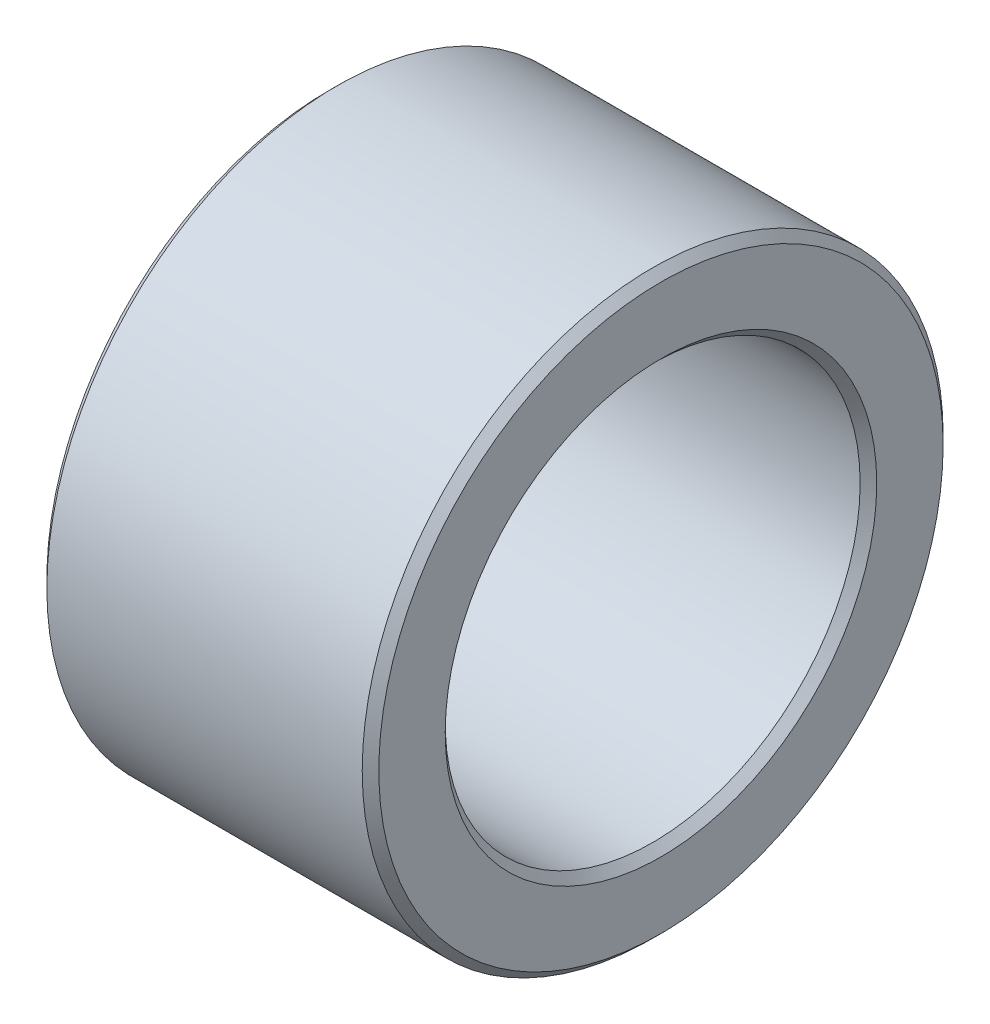
ISO-10303-21;
HEADER;
FILE_DESCRIPTION(('STEP AP214'),'2;1');
FILE_NAME('part.step','',(''),(''),'','','');
FILE_SCHEMA(('AUTOMOTIVE_DESIGN { 1 0 10303 214 1 1 1 1 }'));
ENDSEC;
DATA;
#1=APPLICATION_CONTEXT('core data for automotive mechanical design processes');
#2=APPLICATION_PROTOCOL_DEFINITION('international standard','automotive_design',2000,#1);
#3=PRODUCT_CONTEXT('',#1,'mechanical');
#4=PRODUCT('Part','Part','',(#3));
#5=PRODUCT_RELATED_PRODUCT_CATEGORY('part','',(#4));
#6=PRODUCT_DEFINITION_FORMATION('','',#4);
#7=PRODUCT_DEFINITION_CONTEXT('part definition',#1,'design');
#8=PRODUCT_DEFINITION('design','',#6,#7);
#9=PRODUCT_DEFINITION_SHAPE('','',#8);
#10=(LENGTH_UNIT() NAMED_UNIT(*) SI_UNIT(.MILLI.,.METRE.));
#11=(NAMED_UNIT(*) PLANE_ANGLE_UNIT() SI_UNIT($,.RADIAN.));
#12=(NAMED_UNIT(*) SI_UNIT($,.STERADIAN.) SOLID_ANGLE_UNIT());
#13=UNCERTAINTY_MEASURE_WITH_UNIT(LENGTH_MEASURE(1.E-05),#10,'distance_accuracy_value','');
#14=(GEOMETRIC_REPRESENTATION_CONTEXT(3) GLOBAL_UNCERTAINTY_ASSIGNED_CONTEXT((#13)) GLOBAL_UNIT_ASSIGNED_CONTEXT((#10,
#11,#12)) REPRESENTATION_CONTEXT('',''));
#15=CARTESIAN_POINT('',(0.,0.,0.));
#16=DIRECTION('',(0.,0.,1.));
#17=DIRECTION('',(1.,0.,0.));
#18=AXIS2_PLACEMENT_3D('',#15,#16,#17);
#19=CARTESIAN_POINT('',(4.,0.,0.));
#20=DIRECTION('',(1.,0.,0.));
#21=DIRECTION('',(0.,0.,-1.));
#22=AXIS2_PLACEMENT_3D('',#19,#20,#21);
#23=PLANE('',#22);
#24=CARTESIAN_POINT('',(4.,0.,0.));
#25=DIRECTION('',(1.,0.,0.));
#26=DIRECTION('',(0.,0.,-1.));
#27=AXIS2_PLACEMENT_3D('',#24,#25,#26);
#28=CIRCLE('',#27,2.6);
#29=CARTESIAN_POINT('',(4.,0.,-2.6));
#30=VERTEX_POINT('',#29);
#31=EDGE_CURVE('E70',#30,#30,#28,.F.);
#32=ORIENTED_EDGE('',*,*,#31,.T.);
#33=EDGE_LOOP('',(#32));
#34=FACE_BOUND('',#33,.T.);
#35=CARTESIAN_POINT('',(4.,0.,0.));
#36=DIRECTION('',(1.,0.,0.));
#37=DIRECTION('',(0.,0.,-1.));
#38=AXIS2_PLACEMENT_3D('',#35,#36,#37);
#39=CIRCLE('',#38,3.4);
#40=CARTESIAN_POINT('',(4.,0.,-3.4));
#41=VERTEX_POINT('',#40);
#42=EDGE_CURVE('E74',#41,#41,#39,.T.);
#43=ORIENTED_EDGE('',*,*,#42,.T.);
#44=EDGE_LOOP('',(#43));
#45=FACE_BOUND('',#44,.T.);
#46=ADVANCED_FACE('F45',(#34,#45),#23,.T.);
#47=CARTESIAN_POINT('',(0.,0.,0.));
#48=DIRECTION('',(1.,0.,0.));
#49=DIRECTION('',(0.,0.,-1.));
#50=AXIS2_PLACEMENT_3D('',#47,#48,#49);
#51=PLANE('',#50);
#52=CARTESIAN_POINT('',(0.,0.,0.));
#53=DIRECTION('',(1.,0.,0.));
#54=DIRECTION('',(0.,0.,-1.));
#55=AXIS2_PLACEMENT_3D('',#52,#53,#54);
#56=CIRCLE('',#55,2.6);
#57=CARTESIAN_POINT('',(0.,0.,-2.6));
#58=VERTEX_POINT('',#57);
#59=EDGE_CURVE('E59',#58,#58,#56,.T.);
#60=ORIENTED_EDGE('',*,*,#59,.T.);
#61=EDGE_LOOP('',(#60));
#62=FACE_BOUND('',#61,.T.);
#63=CARTESIAN_POINT('',(0.,0.,0.));
#64=DIRECTION('',(1.,0.,0.));
#65=DIRECTION('',(0.,0.,-1.));
#66=AXIS2_PLACEMENT_3D('',#63,#64,#65);
#67=CIRCLE('',#66,3.4);
#68=CARTESIAN_POINT('',(0.,0.,-3.4));
#69=VERTEX_POINT('',#68);
#70=EDGE_CURVE('E64',#69,#69,#67,.F.);
#71=ORIENTED_EDGE('',*,*,#70,.T.);
#72=EDGE_LOOP('',(#71));
#73=FACE_BOUND('',#72,.T.);
#74=ADVANCED_FACE('F97',(#62,#73),#51,.F.);
#75=CARTESIAN_POINT('',(4.,0.,0.));
#76=DIRECTION('',(-1.,0.,0.));
#77=DIRECTION('',(0.,0.,1.));
#78=AXIS2_PLACEMENT_3D('',#75,#76,#77);
#79=CYLINDRICAL_SURFACE('',#78,3.5);
#80=CARTESIAN_POINT('',(0.100000000000001,0.,0.));
#81=DIRECTION('',(1.,0.,0.));
#82=DIRECTION('',(0.,0.,-1.));
#83=AXIS2_PLACEMENT_3D('',#80,#81,#82);
#84=CIRCLE('',#83,3.5);
#85=CARTESIAN_POINT('',(0.100000000000001,0.,-3.5));
#86=VERTEX_POINT('',#85);
#87=EDGE_CURVE('E10',#86,#86,#84,.T.);
#88=ORIENTED_EDGE('',*,*,#87,.T.);
#89=EDGE_LOOP('',(#88));
#90=FACE_BOUND('',#89,.T.);
#91=CARTESIAN_POINT('',(3.9,0.,0.));
#92=DIRECTION('',(1.,0.,0.));
#93=DIRECTION('',(0.,0.,-1.));
#94=AXIS2_PLACEMENT_3D('',#91,#92,#93);
#95=CIRCLE('',#94,3.5);
#96=CARTESIAN_POINT('',(3.9,0.,-3.5));
#97=VERTEX_POINT('',#96);
#98=EDGE_CURVE('E54',#97,#97,#95,.F.);
#99=ORIENTED_EDGE('',*,*,#98,.T.);
#100=EDGE_LOOP('',(#99));
#101=FACE_BOUND('',#100,.T.);
#102=ADVANCED_FACE('F100',(#90,#101),#79,.T.);
#103=CARTESIAN_POINT('',(4.,0.,0.));
#104=DIRECTION('',(-1.,0.,0.));
#105=DIRECTION('',(0.,0.,1.));
#106=AXIS2_PLACEMENT_3D('',#103,#104,#105);
#107=CYLINDRICAL_SURFACE('',#106,2.5);
#108=CARTESIAN_POINT('',(3.9,0.,0.));
#109=DIRECTION('',(1.,0.,0.));
#110=DIRECTION('',(0.,0.,-1.));
#111=AXIS2_PLACEMENT_3D('',#108,#109,#110);
#112=CIRCLE('',#111,2.5);
#113=CARTESIAN_POINT('',(3.9,0.,-2.5));
#114=VERTEX_POINT('',#113);
#115=EDGE_CURVE('E78',#114,#114,#112,.T.);
#116=ORIENTED_EDGE('',*,*,#115,.T.);
#117=EDGE_LOOP('',(#116));
#118=FACE_BOUND('',#117,.T.);
#119=CARTESIAN_POINT('',(0.0999999999999994,0.,0.));
#120=DIRECTION('',(1.,0.,0.));
#121=DIRECTION('',(0.,0.,-1.));
#122=AXIS2_PLACEMENT_3D('',#119,#120,#121);
#123=CIRCLE('',#122,2.5);
#124=CARTESIAN_POINT('',(0.0999999999999994,0.,-2.5));
#125=VERTEX_POINT('',#124);
#126=EDGE_CURVE('E82',#125,#125,#123,.F.);
#127=ORIENTED_EDGE('',*,*,#126,.T.);
#128=EDGE_LOOP('',(#127));
#129=FACE_BOUND('',#128,.T.);
#130=ADVANCED_FACE('F87',(#118,#129),#107,.F.);
#131=CARTESIAN_POINT('',(3.9,0.,0.));
#132=DIRECTION('',(1.,0.,0.));
#133=DIRECTION('',(0.,0.,-1.));
#134=AXIS2_PLACEMENT_3D('',#131,#132,#133);
#135=CONICAL_SURFACE('',#134,2.5,0.785398163397448);
#136=ORIENTED_EDGE('',*,*,#31,.F.);
#137=EDGE_LOOP('',(#136));
#138=FACE_BOUND('',#137,.T.);
#139=ORIENTED_EDGE('',*,*,#115,.F.);
#140=EDGE_LOOP('',(#139));
#141=FACE_BOUND('',#140,.T.);
#142=ADVANCED_FACE('F93',(#138,#141),#135,.F.);
#143=CARTESIAN_POINT('',(0.,0.,0.));
#144=DIRECTION('',(-1.,0.,0.));
#145=DIRECTION('',(0.,0.,1.));
#146=AXIS2_PLACEMENT_3D('',#143,#144,#145);
#147=CONICAL_SURFACE('',#146,2.6,0.785398163397446);
#148=ORIENTED_EDGE('',*,*,#126,.F.);
#149=EDGE_LOOP('',(#148));
#150=FACE_BOUND('',#149,.T.);
#151=ORIENTED_EDGE('',*,*,#59,.F.);
#152=EDGE_LOOP('',(#151));
#153=FACE_BOUND('',#152,.T.);
#154=ADVANCED_FACE('F89',(#150,#153),#147,.F.);
#155=CARTESIAN_POINT('',(0.100000000000001,0.,0.));
#156=DIRECTION('',(1.,0.,0.));
#157=DIRECTION('',(0.,0.,-1.));
#158=AXIS2_PLACEMENT_3D('',#155,#156,#157);
#159=CONICAL_SURFACE('',#158,3.5,0.785398163397453);
#160=ORIENTED_EDGE('',*,*,#70,.F.);
#161=EDGE_LOOP('',(#160));
#162=FACE_BOUND('',#161,.T.);
#163=ORIENTED_EDGE('',*,*,#87,.F.);
#164=EDGE_LOOP('',(#163));
#165=FACE_BOUND('',#164,.T.);
#166=ADVANCED_FACE('F92',(#162,#165),#159,.T.);
#167=CARTESIAN_POINT('',(4.,0.,0.));
#168=DIRECTION('',(-1.,0.,0.));
#169=DIRECTION('',(0.,0.,1.));
#170=AXIS2_PLACEMENT_3D('',#167,#168,#169);
#171=CONICAL_SURFACE('',#170,3.4,0.785398163397446);
#172=ORIENTED_EDGE('',*,*,#98,.F.);
#173=EDGE_LOOP('',(#172));
#174=FACE_BOUND('',#173,.T.);
#175=ORIENTED_EDGE('',*,*,#42,.F.);
#176=EDGE_LOOP('',(#175));
#177=FACE_BOUND('',#176,.T.);
#178=ADVANCED_FACE('F48',(#174,#177),#171,.T.);
#179=CLOSED_SHELL('',(#46,#74,#102,#130,#142,#154,#166,#178));
#180=MANIFOLD_SOLID_BREP('B2',#179);
#181=ADVANCED_BREP_SHAPE_REPRESENTATION('',(#18,#180),#14);
#182=SHAPE_DEFINITION_REPRESENTATION(#9,#181);
ENDSEC;
END-ISO-10303-21;
